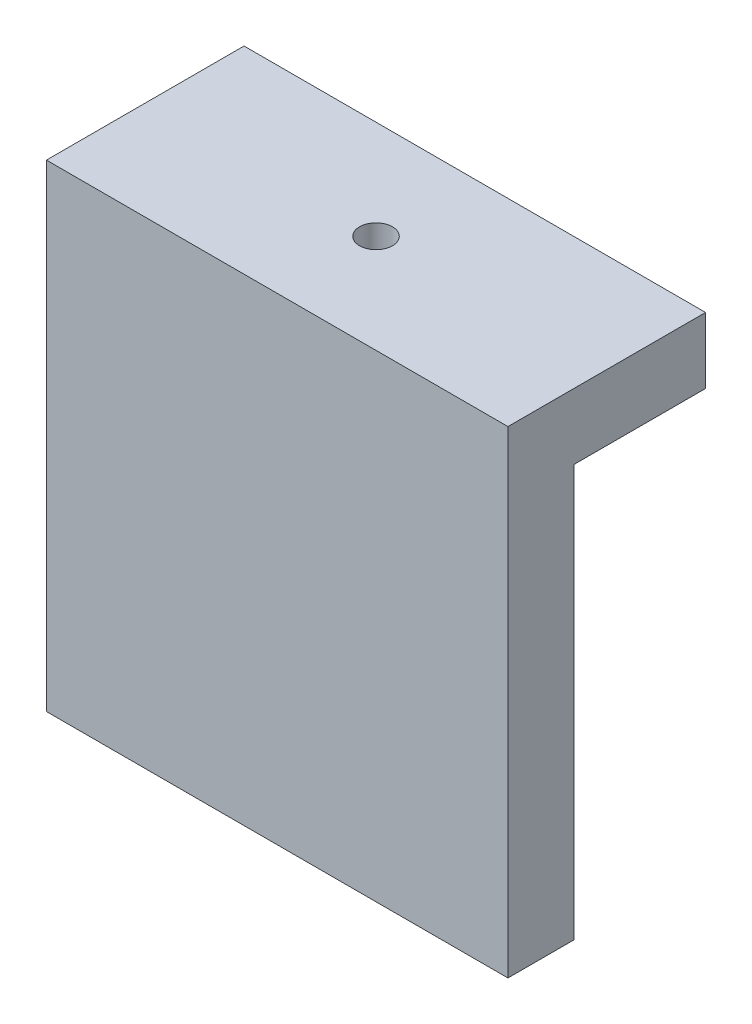
ISO-10303-21;
HEADER;
FILE_DESCRIPTION(('STEP AP214'),'2;1');
FILE_NAME('part.step','',(''),(''),'','','');
FILE_SCHEMA(('AUTOMOTIVE_DESIGN { 1 0 10303 214 1 1 1 1 }'));
ENDSEC;
DATA;
#1=APPLICATION_CONTEXT('core data for automotive mechanical design processes');
#2=APPLICATION_PROTOCOL_DEFINITION('international standard','automotive_design',2000,#1);
#3=PRODUCT_CONTEXT('',#1,'mechanical');
#4=PRODUCT('Part','Part','',(#3));
#5=PRODUCT_RELATED_PRODUCT_CATEGORY('part','',(#4));
#6=PRODUCT_DEFINITION_FORMATION('','',#4);
#7=PRODUCT_DEFINITION_CONTEXT('part definition',#1,'design');
#8=PRODUCT_DEFINITION('design','',#6,#7);
#9=PRODUCT_DEFINITION_SHAPE('','',#8);
#10=(LENGTH_UNIT() NAMED_UNIT(*) SI_UNIT(.MILLI.,.METRE.));
#11=(NAMED_UNIT(*) PLANE_ANGLE_UNIT() SI_UNIT($,.RADIAN.));
#12=(NAMED_UNIT(*) SI_UNIT($,.STERADIAN.) SOLID_ANGLE_UNIT());
#13=UNCERTAINTY_MEASURE_WITH_UNIT(LENGTH_MEASURE(1.E-05),#10,'distance_accuracy_value','');
#14=(GEOMETRIC_REPRESENTATION_CONTEXT(3) GLOBAL_UNCERTAINTY_ASSIGNED_CONTEXT((#13)) GLOBAL_UNIT_ASSIGNED_CONTEXT((#10,
#11,#12)) REPRESENTATION_CONTEXT('',''));
#15=CARTESIAN_POINT('',(0.,0.,0.));
#16=DIRECTION('',(0.,0.,1.));
#17=DIRECTION('',(1.,0.,0.));
#18=AXIS2_PLACEMENT_3D('',#15,#16,#17);
#19=CARTESIAN_POINT('',(20.025,-25.,4.));
#20=DIRECTION('',(0.,1.,0.));
#21=DIRECTION('',(-1.,0.,0.));
#22=AXIS2_PLACEMENT_3D('',#19,#20,#21);
#23=PLANE('',#22);
#24=DIRECTION('',(0.,0.,1.));
#25=VECTOR('',#24,1.);
#26=CARTESIAN_POINT('',(-28.025,-25.,4.));
#27=LINE('',#26,#25);
#28=CARTESIAN_POINT('',(-28.025,-25.,-4.00000000000001));
#29=VERTEX_POINT('',#28);
#30=CARTESIAN_POINT('',(-28.025,-25.,4.));
#31=VERTEX_POINT('',#30);
#32=EDGE_CURVE('E125',#29,#31,#27,.T.);
#33=ORIENTED_EDGE('',*,*,#32,.F.);
#34=DIRECTION('',(1.,0.,0.));
#35=VECTOR('',#34,1.);
#36=CARTESIAN_POINT('',(20.025,-25.,-4.));
#37=LINE('',#36,#35);
#38=CARTESIAN_POINT('',(28.025,-25.,-4.00000000000001));
#39=VERTEX_POINT('',#38);
#40=EDGE_CURVE('E135',#29,#39,#37,.T.);
#41=ORIENTED_EDGE('',*,*,#40,.T.);
#42=DIRECTION('',(0.,0.,-1.));
#43=VECTOR('',#42,1.);
#44=CARTESIAN_POINT('',(28.025,-25.,-20.));
#45=LINE('',#44,#43);
#46=CARTESIAN_POINT('',(28.025,-25.,4.));
#47=VERTEX_POINT('',#46);
#48=EDGE_CURVE('E119',#47,#39,#45,.T.);
#49=ORIENTED_EDGE('',*,*,#48,.F.);
#50=DIRECTION('',(1.,0.,0.));
#51=VECTOR('',#50,1.);
#52=CARTESIAN_POINT('',(20.025,-25.,4.));
#53=LINE('',#52,#51);
#54=EDGE_CURVE('E11',#31,#47,#53,.T.);
#55=ORIENTED_EDGE('',*,*,#54,.F.);
#56=EDGE_LOOP('',(#33,#41,#49,#55));
#57=FACE_BOUND('',#56,.T.);
#58=ADVANCED_FACE('F38',(#57),#23,.F.);
#59=CARTESIAN_POINT('',(0.,0.,4.));
#60=DIRECTION('',(0.,0.,1.));
#61=DIRECTION('',(1.,0.,0.));
#62=AXIS2_PLACEMENT_3D('',#59,#60,#61);
#63=PLANE('',#62);
#64=DIRECTION('',(-1.,0.,0.));
#65=VECTOR('',#64,1.);
#66=CARTESIAN_POINT('',(28.025,33.,4.));
#67=LINE('',#66,#65);
#68=CARTESIAN_POINT('',(28.025,33.,4.));
#69=VERTEX_POINT('',#68);
#70=CARTESIAN_POINT('',(-28.025,33.,4.));
#71=VERTEX_POINT('',#70);
#72=EDGE_CURVE('E131',#69,#71,#67,.T.);
#73=ORIENTED_EDGE('',*,*,#72,.T.);
#74=DIRECTION('',(0.,1.,0.));
#75=VECTOR('',#74,1.);
#76=CARTESIAN_POINT('',(-28.025,-25.,4.));
#77=LINE('',#76,#75);
#78=EDGE_CURVE('E105',#31,#71,#77,.T.);
#79=ORIENTED_EDGE('',*,*,#78,.F.);
#80=ORIENTED_EDGE('',*,*,#54,.T.);
#81=DIRECTION('',(0.,-1.,0.));
#82=VECTOR('',#81,1.);
#83=CARTESIAN_POINT('',(28.025,-25.,4.));
#84=LINE('',#83,#82);
#85=EDGE_CURVE('E123',#69,#47,#84,.T.);
#86=ORIENTED_EDGE('',*,*,#85,.F.);
#87=EDGE_LOOP('',(#73,#79,#80,#86));
#88=FACE_BOUND('',#87,.T.);
#89=ADVANCED_FACE('F172',(#88),#63,.T.);
#90=CARTESIAN_POINT('',(0.,0.,-4.));
#91=DIRECTION('',(0.,0.,1.));
#92=DIRECTION('',(1.,0.,0.));
#93=AXIS2_PLACEMENT_3D('',#90,#91,#92);
#94=PLANE('',#93);
#95=ORIENTED_EDGE('',*,*,#40,.F.);
#96=DIRECTION('',(0.,1.,0.));
#97=VECTOR('',#96,1.);
#98=CARTESIAN_POINT('',(-28.025,0.,-4.00000000000001));
#99=LINE('',#98,#97);
#100=CARTESIAN_POINT('',(-28.025,25.,-4.00000000000001));
#101=VERTEX_POINT('',#100);
#102=EDGE_CURVE('E144',#29,#101,#99,.T.);
#103=ORIENTED_EDGE('',*,*,#102,.T.);
#104=DIRECTION('',(-1.,0.,0.));
#105=VECTOR('',#104,1.);
#106=CARTESIAN_POINT('',(20.025,25.,-4.));
#107=LINE('',#106,#105);
#108=CARTESIAN_POINT('',(28.025,25.,-4.00000000000001));
#109=VERTEX_POINT('',#108);
#110=EDGE_CURVE('E41',#109,#101,#107,.T.);
#111=ORIENTED_EDGE('',*,*,#110,.F.);
#112=DIRECTION('',(0.,-1.,0.));
#113=VECTOR('',#112,1.);
#114=CARTESIAN_POINT('',(28.025,-25.,-4.00000000000001));
#115=LINE('',#114,#113);
#116=EDGE_CURVE('E113',#109,#39,#115,.T.);
#117=ORIENTED_EDGE('',*,*,#116,.T.);
#118=EDGE_LOOP('',(#95,#103,#111,#117));
#119=FACE_BOUND('',#118,.T.);
#120=ADVANCED_FACE('F145',(#119),#94,.F.);
#121=CARTESIAN_POINT('',(28.025,33.,-20.));
#122=DIRECTION('',(0.,0.,1.));
#123=DIRECTION('',(0.,-1.,0.));
#124=AXIS2_PLACEMENT_3D('',#121,#122,#123);
#125=PLANE('',#124);
#126=DIRECTION('',(0.,1.,0.));
#127=VECTOR('',#126,1.);
#128=CARTESIAN_POINT('',(28.025,33.,-20.));
#129=LINE('',#128,#127);
#130=CARTESIAN_POINT('',(28.025,25.,-20.));
#131=VERTEX_POINT('',#130);
#132=CARTESIAN_POINT('',(28.025,33.,-20.));
#133=VERTEX_POINT('',#132);
#134=EDGE_CURVE('E110',#131,#133,#129,.T.);
#135=ORIENTED_EDGE('',*,*,#134,.F.);
#136=DIRECTION('',(1.,0.,0.));
#137=VECTOR('',#136,1.);
#138=CARTESIAN_POINT('',(16.025,25.,-20.));
#139=LINE('',#138,#137);
#140=CARTESIAN_POINT('',(-28.025,25.,-20.));
#141=VERTEX_POINT('',#140);
#142=EDGE_CURVE('E92',#141,#131,#139,.T.);
#143=ORIENTED_EDGE('',*,*,#142,.F.);
#144=DIRECTION('',(0.,-1.,0.));
#145=VECTOR('',#144,1.);
#146=CARTESIAN_POINT('',(-28.025,-25.,-20.));
#147=LINE('',#146,#145);
#148=CARTESIAN_POINT('',(-28.025,33.,-20.));
#149=VERTEX_POINT('',#148);
#150=EDGE_CURVE('E152',#149,#141,#147,.T.);
#151=ORIENTED_EDGE('',*,*,#150,.F.);
#152=DIRECTION('',(-1.,0.,0.));
#153=VECTOR('',#152,1.);
#154=CARTESIAN_POINT('',(28.025,33.,-20.));
#155=LINE('',#154,#153);
#156=EDGE_CURVE('E117',#133,#149,#155,.T.);
#157=ORIENTED_EDGE('',*,*,#156,.F.);
#158=EDGE_LOOP('',(#135,#143,#151,#157));
#159=FACE_BOUND('',#158,.T.);
#160=ADVANCED_FACE('F116',(#159),#125,.F.);
#161=CARTESIAN_POINT('',(28.025,33.,4.));
#162=DIRECTION('',(0.,-1.,0.));
#163=DIRECTION('',(0.,0.,-1.));
#164=AXIS2_PLACEMENT_3D('',#161,#162,#163);
#165=PLANE('',#164);
#166=CARTESIAN_POINT('',(0.,33.,-8.));
#167=DIRECTION('',(0.,1.,0.));
#168=DIRECTION('',(0.,0.,1.));
#169=AXIS2_PLACEMENT_3D('',#166,#167,#168);
#170=CIRCLE('',#169,2.);
#171=CARTESIAN_POINT('',(0.,33.,-6.));
#172=VERTEX_POINT('',#171);
#173=EDGE_CURVE('E148',#172,#172,#170,.T.);
#174=ORIENTED_EDGE('',*,*,#173,.F.);
#175=EDGE_LOOP('',(#174));
#176=FACE_BOUND('',#175,.T.);
#177=ORIENTED_EDGE('',*,*,#156,.T.);
#178=DIRECTION('',(0.,0.,-1.));
#179=VECTOR('',#178,1.);
#180=CARTESIAN_POINT('',(-28.025,33.,4.));
#181=LINE('',#180,#179);
#182=EDGE_CURVE('E167',#71,#149,#181,.T.);
#183=ORIENTED_EDGE('',*,*,#182,.F.);
#184=ORIENTED_EDGE('',*,*,#72,.F.);
#185=DIRECTION('',(0.,0.,1.));
#186=VECTOR('',#185,1.);
#187=CARTESIAN_POINT('',(28.025,33.,4.));
#188=LINE('',#187,#186);
#189=EDGE_CURVE('E59',#133,#69,#188,.T.);
#190=ORIENTED_EDGE('',*,*,#189,.F.);
#191=EDGE_LOOP('',(#177,#183,#184,#190));
#192=FACE_BOUND('',#191,.T.);
#193=ADVANCED_FACE('F175',(#176,#192),#165,.F.);
#194=CARTESIAN_POINT('',(28.025,0.,0.));
#195=DIRECTION('',(-1.,0.,0.));
#196=DIRECTION('',(0.,0.,1.));
#197=AXIS2_PLACEMENT_3D('',#194,#195,#196);
#198=PLANE('',#197);
#199=ORIENTED_EDGE('',*,*,#48,.T.);
#200=ORIENTED_EDGE('',*,*,#116,.F.);
#201=DIRECTION('',(0.,0.,1.));
#202=VECTOR('',#201,1.);
#203=CARTESIAN_POINT('',(28.025,25.,-4.00000000000001));
#204=LINE('',#203,#202);
#205=EDGE_CURVE('E96',#131,#109,#204,.T.);
#206=ORIENTED_EDGE('',*,*,#205,.F.);
#207=ORIENTED_EDGE('',*,*,#134,.T.);
#208=ORIENTED_EDGE('',*,*,#189,.T.);
#209=ORIENTED_EDGE('',*,*,#85,.T.);
#210=EDGE_LOOP('',(#199,#200,#206,#207,#208,#209));
#211=FACE_BOUND('',#210,.T.);
#212=ADVANCED_FACE('F109',(#211),#198,.F.);
#213=CARTESIAN_POINT('',(-28.025,0.,0.));
#214=DIRECTION('',(-1.,0.,0.));
#215=DIRECTION('',(0.,0.,1.));
#216=AXIS2_PLACEMENT_3D('',#213,#214,#215);
#217=PLANE('',#216);
#218=ORIENTED_EDGE('',*,*,#102,.F.);
#219=ORIENTED_EDGE('',*,*,#32,.T.);
#220=ORIENTED_EDGE('',*,*,#78,.T.);
#221=ORIENTED_EDGE('',*,*,#182,.T.);
#222=ORIENTED_EDGE('',*,*,#150,.T.);
#223=DIRECTION('',(0.,0.,-1.));
#224=VECTOR('',#223,1.);
#225=CARTESIAN_POINT('',(-28.025,25.,0.));
#226=LINE('',#225,#224);
#227=EDGE_CURVE('E99',#101,#141,#226,.T.);
#228=ORIENTED_EDGE('',*,*,#227,.F.);
#229=EDGE_LOOP('',(#218,#219,#220,#221,#222,#228));
#230=FACE_BOUND('',#229,.T.);
#231=ADVANCED_FACE('F150',(#230),#217,.T.);
#232=CARTESIAN_POINT('',(-82.7944193059009,25.,0.));
#233=DIRECTION('',(0.,1.,0.));
#234=DIRECTION('',(0.,0.,1.));
#235=AXIS2_PLACEMENT_3D('',#232,#233,#234);
#236=PLANE('',#235);
#237=ORIENTED_EDGE('',*,*,#205,.T.);
#238=ORIENTED_EDGE('',*,*,#110,.T.);
#239=ORIENTED_EDGE('',*,*,#227,.T.);
#240=ORIENTED_EDGE('',*,*,#142,.T.);
#241=EDGE_LOOP('',(#237,#238,#239,#240));
#242=FACE_BOUND('',#241,.T.);
#243=CARTESIAN_POINT('',(0.,25.,-8.));
#244=DIRECTION('',(0.,1.,0.));
#245=DIRECTION('',(0.,0.,1.));
#246=AXIS2_PLACEMENT_3D('',#243,#244,#245);
#247=CIRCLE('',#246,2.);
#248=CARTESIAN_POINT('',(0.,25.,-6.));
#249=VERTEX_POINT('',#248);
#250=EDGE_CURVE('E106',#249,#249,#247,.T.);
#251=ORIENTED_EDGE('',*,*,#250,.T.);
#252=EDGE_LOOP('',(#251));
#253=FACE_BOUND('',#252,.T.);
#254=ADVANCED_FACE('F94',(#242,#253),#236,.F.);
#255=CARTESIAN_POINT('',(0.,25.,-8.));
#256=DIRECTION('',(0.,1.,0.));
#257=DIRECTION('',(0.,0.,1.));
#258=AXIS2_PLACEMENT_3D('',#255,#256,#257);
#259=CYLINDRICAL_SURFACE('',#258,2.);
#260=ORIENTED_EDGE('',*,*,#250,.F.);
#261=EDGE_LOOP('',(#260));
#262=FACE_BOUND('',#261,.T.);
#263=ORIENTED_EDGE('',*,*,#173,.T.);
#264=EDGE_LOOP('',(#263));
#265=FACE_BOUND('',#264,.T.);
#266=ADVANCED_FACE('F203',(#262,#265),#259,.F.);
#267=CLOSED_SHELL('',(#58,#89,#120,#160,#193,#212,#231,#254,#266));
#268=MANIFOLD_SOLID_BREP('B2',#267);
#269=ADVANCED_BREP_SHAPE_REPRESENTATION('',(#18,#268),#14);
#270=SHAPE_DEFINITION_REPRESENTATION(#9,#269);
ENDSEC;
END-ISO-10303-21;
